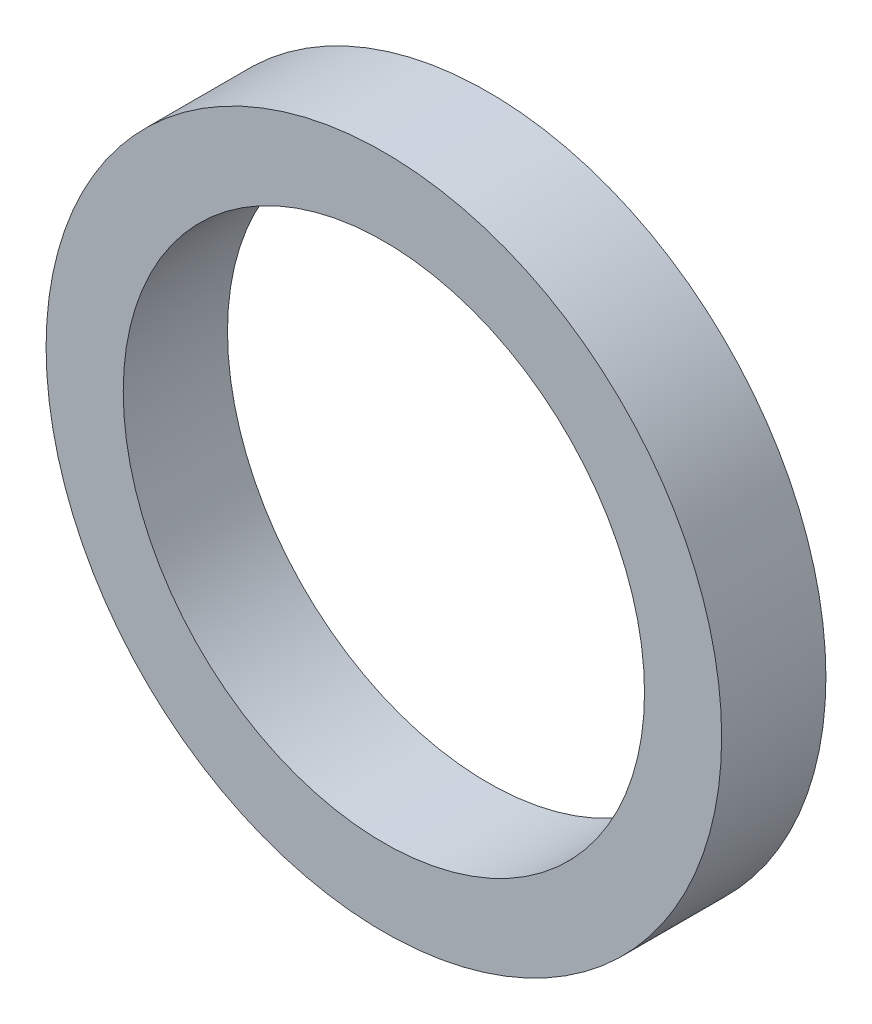
ISO-10303-21;
HEADER;
FILE_DESCRIPTION(('STEP AP214'),'2;1');
FILE_NAME('part.step','',(''),(''),'','','');
FILE_SCHEMA(('AUTOMOTIVE_DESIGN { 1 0 10303 214 1 1 1 1 }'));
ENDSEC;
DATA;
#1=APPLICATION_CONTEXT('core data for automotive mechanical design processes');
#2=APPLICATION_PROTOCOL_DEFINITION('international standard','automotive_design',2000,#1);
#3=PRODUCT_CONTEXT('',#1,'mechanical');
#4=PRODUCT('Part','Part','',(#3));
#5=PRODUCT_RELATED_PRODUCT_CATEGORY('part','',(#4));
#6=PRODUCT_DEFINITION_FORMATION('','',#4);
#7=PRODUCT_DEFINITION_CONTEXT('part definition',#1,'design');
#8=PRODUCT_DEFINITION('design','',#6,#7);
#9=PRODUCT_DEFINITION_SHAPE('','',#8);
#10=(LENGTH_UNIT() NAMED_UNIT(*) SI_UNIT(.MILLI.,.METRE.));
#11=(NAMED_UNIT(*) PLANE_ANGLE_UNIT() SI_UNIT($,.RADIAN.));
#12=(NAMED_UNIT(*) SI_UNIT($,.STERADIAN.) SOLID_ANGLE_UNIT());
#13=UNCERTAINTY_MEASURE_WITH_UNIT(LENGTH_MEASURE(1.E-05),#10,'distance_accuracy_value','');
#14=(GEOMETRIC_REPRESENTATION_CONTEXT(3) GLOBAL_UNCERTAINTY_ASSIGNED_CONTEXT((#13)) GLOBAL_UNIT_ASSIGNED_CONTEXT((#10,
#11,#12)) REPRESENTATION_CONTEXT('',''));
#15=CARTESIAN_POINT('',(0.,0.,0.));
#16=DIRECTION('',(0.,0.,1.));
#17=DIRECTION('',(1.,0.,0.));
#18=AXIS2_PLACEMENT_3D('',#15,#16,#17);
#19=CARTESIAN_POINT('',(0.,0.,2.));
#20=DIRECTION('',(0.,0.,1.));
#21=DIRECTION('',(1.,0.,0.));
#22=AXIS2_PLACEMENT_3D('',#19,#20,#21);
#23=PLANE('',#22);
#24=CARTESIAN_POINT('',(0.,0.,2.));
#25=DIRECTION('',(0.,0.,1.));
#26=DIRECTION('',(1.,0.,0.));
#27=AXIS2_PLACEMENT_3D('',#24,#25,#26);
#28=CIRCLE('',#27,6.48);
#29=CARTESIAN_POINT('',(6.48,0.,2.));
#30=VERTEX_POINT('',#29);
#31=EDGE_CURVE('E10',#30,#30,#28,.T.);
#32=ORIENTED_EDGE('',*,*,#31,.T.);
#33=EDGE_LOOP('',(#32));
#34=FACE_BOUND('',#33,.T.);
#35=CARTESIAN_POINT('',(0.,0.,2.));
#36=DIRECTION('',(0.,0.,1.));
#37=DIRECTION('',(1.,0.,0.));
#38=AXIS2_PLACEMENT_3D('',#35,#36,#37);
#39=CIRCLE('',#38,5.);
#40=CARTESIAN_POINT('',(5.,0.,2.));
#41=VERTEX_POINT('',#40);
#42=EDGE_CURVE('E45',#41,#41,#39,.T.);
#43=ORIENTED_EDGE('',*,*,#42,.F.);
#44=EDGE_LOOP('',(#43));
#45=FACE_BOUND('',#44,.T.);
#46=ADVANCED_FACE('F34',(#34,#45),#23,.T.);
#47=CARTESIAN_POINT('',(0.,0.,0.));
#48=DIRECTION('',(0.,0.,1.));
#49=DIRECTION('',(1.,0.,0.));
#50=AXIS2_PLACEMENT_3D('',#47,#48,#49);
#51=PLANE('',#50);
#52=CARTESIAN_POINT('',(0.,0.,0.));
#53=DIRECTION('',(0.,0.,1.));
#54=DIRECTION('',(1.,0.,0.));
#55=AXIS2_PLACEMENT_3D('',#52,#53,#54);
#56=CIRCLE('',#55,6.48);
#57=CARTESIAN_POINT('',(6.48,0.,0.));
#58=VERTEX_POINT('',#57);
#59=EDGE_CURVE('E38',#58,#58,#56,.T.);
#60=ORIENTED_EDGE('',*,*,#59,.F.);
#61=EDGE_LOOP('',(#60));
#62=FACE_BOUND('',#61,.T.);
#63=CARTESIAN_POINT('',(0.,0.,0.));
#64=DIRECTION('',(0.,0.,1.));
#65=DIRECTION('',(1.,0.,0.));
#66=AXIS2_PLACEMENT_3D('',#63,#64,#65);
#67=CIRCLE('',#66,5.);
#68=CARTESIAN_POINT('',(5.,0.,0.));
#69=VERTEX_POINT('',#68);
#70=EDGE_CURVE('E47',#69,#69,#67,.T.);
#71=ORIENTED_EDGE('',*,*,#70,.T.);
#72=EDGE_LOOP('',(#71));
#73=FACE_BOUND('',#72,.T.);
#74=ADVANCED_FACE('F57',(#62,#73),#51,.F.);
#75=CARTESIAN_POINT('',(0.,0.,2.));
#76=DIRECTION('',(0.,0.,-1.));
#77=DIRECTION('',(-1.,0.,0.));
#78=AXIS2_PLACEMENT_3D('',#75,#76,#77);
#79=CYLINDRICAL_SURFACE('',#78,6.48);
#80=ORIENTED_EDGE('',*,*,#31,.F.);
#81=EDGE_LOOP('',(#80));
#82=FACE_BOUND('',#81,.T.);
#83=ORIENTED_EDGE('',*,*,#59,.T.);
#84=EDGE_LOOP('',(#83));
#85=FACE_BOUND('',#84,.T.);
#86=ADVANCED_FACE('F36',(#82,#85),#79,.T.);
#87=CARTESIAN_POINT('',(0.,0.,2.));
#88=DIRECTION('',(0.,0.,-1.));
#89=DIRECTION('',(-1.,0.,0.));
#90=AXIS2_PLACEMENT_3D('',#87,#88,#89);
#91=CYLINDRICAL_SURFACE('',#90,5.);
#92=ORIENTED_EDGE('',*,*,#42,.T.);
#93=EDGE_LOOP('',(#92));
#94=FACE_BOUND('',#93,.T.);
#95=ORIENTED_EDGE('',*,*,#70,.F.);
#96=EDGE_LOOP('',(#95));
#97=FACE_BOUND('',#96,.T.);
#98=ADVANCED_FACE('F53',(#94,#97),#91,.F.);
#99=CLOSED_SHELL('',(#46,#74,#86,#98));
#100=MANIFOLD_SOLID_BREP('B2',#99);
#101=ADVANCED_BREP_SHAPE_REPRESENTATION('',(#18,#100),#14);
#102=SHAPE_DEFINITION_REPRESENTATION(#9,#101);
ENDSEC;
END-ISO-10303-21;
